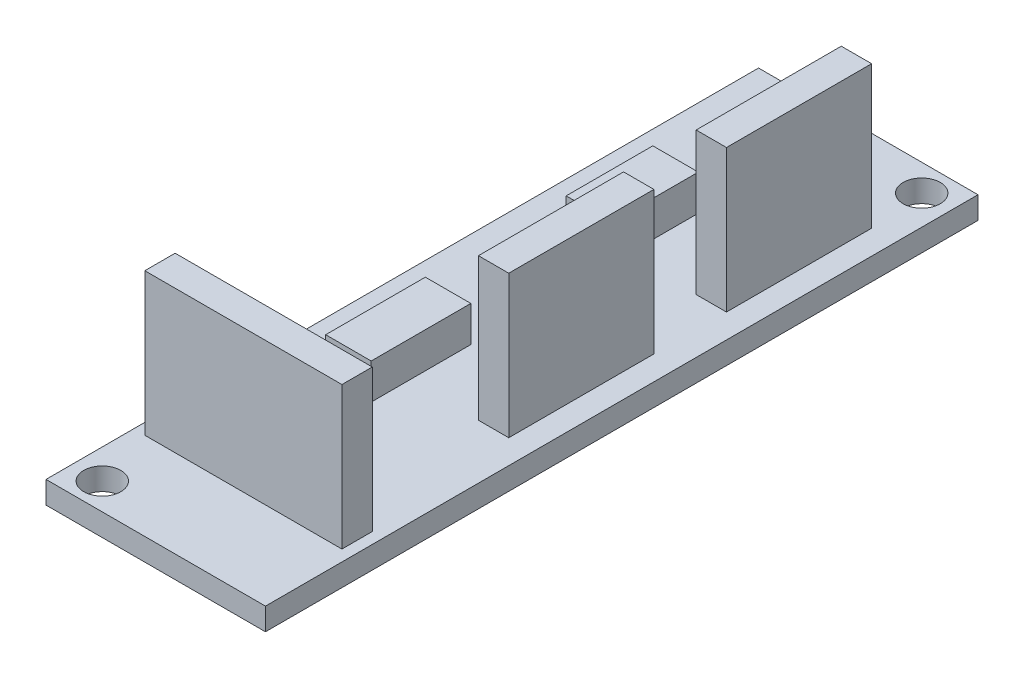
ISO-10303-21;
HEADER;
FILE_DESCRIPTION(('STEP AP214'),'2;1');
FILE_NAME('part.step','',(''),(''),'','','');
FILE_SCHEMA(('AUTOMOTIVE_DESIGN { 1 0 10303 214 1 1 1 1 }'));
ENDSEC;
DATA;
#1=APPLICATION_CONTEXT('core data for automotive mechanical design processes');
#2=APPLICATION_PROTOCOL_DEFINITION('international standard','automotive_design',2000,#1);
#3=PRODUCT_CONTEXT('',#1,'mechanical');
#4=PRODUCT('Part','Part','',(#3));
#5=PRODUCT_RELATED_PRODUCT_CATEGORY('part','',(#4));
#6=PRODUCT_DEFINITION_FORMATION('','',#4);
#7=PRODUCT_DEFINITION_CONTEXT('part definition',#1,'design');
#8=PRODUCT_DEFINITION('design','',#6,#7);
#9=PRODUCT_DEFINITION_SHAPE('','',#8);
#10=(LENGTH_UNIT() NAMED_UNIT(*) SI_UNIT(.MILLI.,.METRE.));
#11=(NAMED_UNIT(*) PLANE_ANGLE_UNIT() SI_UNIT($,.RADIAN.));
#12=(NAMED_UNIT(*) SI_UNIT($,.STERADIAN.) SOLID_ANGLE_UNIT());
#13=UNCERTAINTY_MEASURE_WITH_UNIT(LENGTH_MEASURE(1.E-05),#10,'distance_accuracy_value','');
#14=(GEOMETRIC_REPRESENTATION_CONTEXT(3) GLOBAL_UNCERTAINTY_ASSIGNED_CONTEXT((#13)) GLOBAL_UNIT_ASSIGNED_CONTEXT((#10,
#11,#12)) REPRESENTATION_CONTEXT('',''));
#15=CARTESIAN_POINT('',(0.,0.,0.));
#16=DIRECTION('',(0.,0.,1.));
#17=DIRECTION('',(1.,0.,0.));
#18=AXIS2_PLACEMENT_3D('',#15,#16,#17);
#19=CARTESIAN_POINT('',(0.,1.984375,0.));
#20=DIRECTION('',(0.,1.,0.));
#21=DIRECTION('',(0.,0.,1.));
#22=AXIS2_PLACEMENT_3D('',#19,#20,#21);
#23=PLANE('',#22);
#24=DIRECTION('',(1.,0.,0.));
#25=VECTOR('',#24,1.);
#26=CARTESIAN_POINT('',(-5.30932015618599,1.984375,-17.8586223435347));
#27=LINE('',#26,#25);
#28=CARTESIAN_POINT('',(-5.30932015618599,1.984375,-17.8586223435347));
#29=VERTEX_POINT('',#28);
#30=CARTESIAN_POINT('',(-1.25493021873488,1.984375,-17.8586223435347));
#31=VERTEX_POINT('',#30);
#32=EDGE_CURVE('E189',#29,#31,#27,.T.);
#33=ORIENTED_EDGE('',*,*,#32,.T.);
#34=DIRECTION('',(0.,0.,1.));
#35=VECTOR('',#34,1.);
#36=CARTESIAN_POINT('',(-1.25493021873488,1.984375,-17.8586223435347));
#37=LINE('',#36,#35);
#38=CARTESIAN_POINT('',(-1.25493021873488,1.984375,-10.1359748436278));
#39=VERTEX_POINT('',#38);
#40=EDGE_CURVE('E193',#31,#39,#37,.T.);
#41=ORIENTED_EDGE('',*,*,#40,.T.);
#42=DIRECTION('',(1.,0.,0.));
#43=VECTOR('',#42,1.);
#44=CARTESIAN_POINT('',(-5.30932015618599,1.984375,-10.1359748436278));
#45=LINE('',#44,#43);
#46=CARTESIAN_POINT('',(-5.30932015618599,1.984375,-10.1359748436278));
#47=VERTEX_POINT('',#46);
#48=EDGE_CURVE('E52',#47,#39,#45,.T.);
#49=ORIENTED_EDGE('',*,*,#48,.F.);
#50=DIRECTION('',(0.,0.,1.));
#51=VECTOR('',#50,1.);
#52=CARTESIAN_POINT('',(-5.30932015618599,1.984375,-17.8586223435347));
#53=LINE('',#52,#51);
#54=EDGE_CURVE('E47',#29,#47,#53,.T.);
#55=ORIENTED_EDGE('',*,*,#54,.F.);
#56=EDGE_LOOP('',(#33,#41,#49,#55));
#57=FACE_BOUND('',#56,.T.);
#58=DIRECTION('',(1.,0.,0.));
#59=VECTOR('',#58,1.);
#60=CARTESIAN_POINT('',(-5.30932015618599,1.984375,2.41332734372091));
#61=LINE('',#60,#59);
#62=CARTESIAN_POINT('',(-5.30932015618599,1.984375,2.41332734372091));
#63=VERTEX_POINT('',#62);
#64=CARTESIAN_POINT('',(-1.25493021873488,1.984375,2.41332734372091));
#65=VERTEX_POINT('',#64);
#66=EDGE_CURVE('E196',#63,#65,#61,.T.);
#67=ORIENTED_EDGE('',*,*,#66,.T.);
#68=DIRECTION('',(0.,0.,1.));
#69=VECTOR('',#68,1.);
#70=CARTESIAN_POINT('',(-1.25493021873488,1.984375,2.41332734372091));
#71=LINE('',#70,#69);
#72=CARTESIAN_POINT('',(-1.25493021873488,1.984375,11.2943719686138));
#73=VERTEX_POINT('',#72);
#74=EDGE_CURVE('E234',#65,#73,#71,.T.);
#75=ORIENTED_EDGE('',*,*,#74,.T.);
#76=DIRECTION('',(1.,0.,0.));
#77=VECTOR('',#76,1.);
#78=CARTESIAN_POINT('',(-5.30932015618599,1.984375,11.2943719686138));
#79=LINE('',#78,#77);
#80=CARTESIAN_POINT('',(-5.30932015618599,1.984375,11.2943719686138));
#81=VERTEX_POINT('',#80);
#82=EDGE_CURVE('E236',#81,#73,#79,.T.);
#83=ORIENTED_EDGE('',*,*,#82,.F.);
#84=DIRECTION('',(0.,0.,1.));
#85=VECTOR('',#84,1.);
#86=CARTESIAN_POINT('',(-5.30932015618599,1.984375,2.41332734372091));
#87=LINE('',#86,#85);
#88=EDGE_CURVE('E225',#63,#81,#87,.T.);
#89=ORIENTED_EDGE('',*,*,#88,.F.);
#90=EDGE_LOOP('',(#67,#75,#83,#89));
#91=FACE_BOUND('',#90,.T.);
#92=DIRECTION('',(0.,0.,-1.));
#93=VECTOR('',#92,1.);
#94=CARTESIAN_POINT('',(-8.78451153114408,1.984375,23.9402072497114));
#95=LINE('',#94,#93);
#96=CARTESIAN_POINT('',(-8.78451153114408,1.984375,23.9402072497114));
#97=VERTEX_POINT('',#96);
#98=CARTESIAN_POINT('',(-8.78451153114408,1.984375,21.2372806247439));
#99=VERTEX_POINT('',#98);
#100=EDGE_CURVE('E274',#97,#99,#95,.T.);
#101=ORIENTED_EDGE('',*,*,#100,.T.);
#102=DIRECTION('',(1.,0.,0.));
#103=VECTOR('',#102,1.);
#104=CARTESIAN_POINT('',(-8.78451153114408,1.984375,21.2372806247439));
#105=LINE('',#104,#103);
#106=CARTESIAN_POINT('',(8.78451153114408,1.984375,21.2372806247439));
#107=VERTEX_POINT('',#106);
#108=EDGE_CURVE('E272',#99,#107,#105,.T.);
#109=ORIENTED_EDGE('',*,*,#108,.T.);
#110=DIRECTION('',(0.,0.,-1.));
#111=VECTOR('',#110,1.);
#112=CARTESIAN_POINT('',(8.78451153114408,1.984375,23.9402072497114));
#113=LINE('',#112,#111);
#114=CARTESIAN_POINT('',(8.78451153114408,1.984375,23.9402072497114));
#115=VERTEX_POINT('',#114);
#116=EDGE_CURVE('E268',#115,#107,#113,.T.);
#117=ORIENTED_EDGE('',*,*,#116,.F.);
#118=DIRECTION('',(1.,0.,0.));
#119=VECTOR('',#118,1.);
#120=CARTESIAN_POINT('',(-8.78451153114408,1.984375,23.9402072497114));
#121=LINE('',#120,#119);
#122=EDGE_CURVE('E265',#97,#115,#121,.T.);
#123=ORIENTED_EDGE('',*,*,#122,.F.);
#124=EDGE_LOOP('',(#101,#109,#117,#123));
#125=FACE_BOUND('',#124,.T.);
#126=DIRECTION('',(1.,0.,0.));
#127=VECTOR('',#126,1.);
#128=CARTESIAN_POINT('',(4.92318778119064,1.984375,-5.01972087493947));
#129=LINE('',#128,#127);
#130=CARTESIAN_POINT('',(4.92318778119064,1.984375,-5.01972087493947));
#131=VERTEX_POINT('',#130);
#132=CARTESIAN_POINT('',(7.62611440615806,1.984375,-5.01972087493947));
#133=VERTEX_POINT('',#132);
#134=EDGE_CURVE('E306',#131,#133,#129,.T.);
#135=ORIENTED_EDGE('',*,*,#134,.T.);
#136=DIRECTION('',(0.,0.,1.));
#137=VECTOR('',#136,1.);
#138=CARTESIAN_POINT('',(7.62611440615806,1.984375,-5.01972087493947));
#139=LINE('',#138,#137);
#140=CARTESIAN_POINT('',(7.62611440615806,1.984375,7.91571368740457));
#141=VERTEX_POINT('',#140);
#142=EDGE_CURVE('E304',#133,#141,#139,.T.);
#143=ORIENTED_EDGE('',*,*,#142,.T.);
#144=DIRECTION('',(1.,0.,0.));
#145=VECTOR('',#144,1.);
#146=CARTESIAN_POINT('',(4.92318778119064,1.984375,7.91571368740457));
#147=LINE('',#146,#145);
#148=CARTESIAN_POINT('',(4.92318778119064,1.984375,7.91571368740457));
#149=VERTEX_POINT('',#148);
#150=EDGE_CURVE('E300',#149,#141,#147,.T.);
#151=ORIENTED_EDGE('',*,*,#150,.F.);
#152=DIRECTION('',(0.,0.,1.));
#153=VECTOR('',#152,1.);
#154=CARTESIAN_POINT('',(4.92318778119064,1.984375,-5.01972087493947));
#155=LINE('',#154,#153);
#156=EDGE_CURVE('E297',#131,#149,#155,.T.);
#157=ORIENTED_EDGE('',*,*,#156,.F.);
#158=EDGE_LOOP('',(#135,#143,#151,#157));
#159=FACE_BOUND('',#158,.T.);
#160=DIRECTION('',(1.,0.,0.));
#161=VECTOR('',#160,1.);
#162=CARTESIAN_POINT('',(4.92318778119063,1.984375,-24.4228727184555));
#163=LINE('',#162,#161);
#164=CARTESIAN_POINT('',(4.92318778119063,1.984375,-24.4228727184555));
#165=VERTEX_POINT('',#164);
#166=CARTESIAN_POINT('',(7.62611440615806,1.984375,-24.4228727184555));
#167=VERTEX_POINT('',#166);
#168=EDGE_CURVE('E308',#165,#167,#163,.T.);
#169=ORIENTED_EDGE('',*,*,#168,.T.);
#170=DIRECTION('',(0.,0.,1.));
#171=VECTOR('',#170,1.);
#172=CARTESIAN_POINT('',(7.62611440615806,1.984375,-24.4228727184555));
#173=LINE('',#172,#171);
#174=CARTESIAN_POINT('',(7.62611440615806,1.984375,-11.4874381561115));
#175=VERTEX_POINT('',#174);
#176=EDGE_CURVE('E330',#167,#175,#173,.T.);
#177=ORIENTED_EDGE('',*,*,#176,.T.);
#178=DIRECTION('',(1.,0.,0.));
#179=VECTOR('',#178,1.);
#180=CARTESIAN_POINT('',(4.92318778119064,1.984375,-11.4874381561115));
#181=LINE('',#180,#179);
#182=CARTESIAN_POINT('',(4.92318778119064,1.984375,-11.4874381561115));
#183=VERTEX_POINT('',#182);
#184=EDGE_CURVE('E332',#183,#175,#181,.T.);
#185=ORIENTED_EDGE('',*,*,#184,.F.);
#186=DIRECTION('',(0.,0.,1.));
#187=VECTOR('',#186,1.);
#188=CARTESIAN_POINT('',(4.92318778119063,1.984375,-24.4228727184555));
#189=LINE('',#188,#187);
#190=EDGE_CURVE('E321',#165,#183,#189,.T.);
#191=ORIENTED_EDGE('',*,*,#190,.F.);
#192=EDGE_LOOP('',(#169,#177,#185,#191));
#193=FACE_BOUND('',#192,.T.);
#194=CARTESIAN_POINT('',(7.14375,1.984375,-29.36875));
#195=DIRECTION('',(0.,1.,0.));
#196=DIRECTION('',(0.,0.,1.));
#197=AXIS2_PLACEMENT_3D('',#194,#195,#196);
#198=CIRCLE('',#197,1.651);
#199=CARTESIAN_POINT('',(7.14375,1.984375,-27.71775));
#200=VERTEX_POINT('',#199);
#201=EDGE_CURVE('E355',#200,#200,#198,.T.);
#202=ORIENTED_EDGE('',*,*,#201,.F.);
#203=EDGE_LOOP('',(#202));
#204=FACE_BOUND('',#203,.T.);
#205=DIRECTION('',(0.,0.,-1.));
#206=VECTOR('',#205,1.);
#207=CARTESIAN_POINT('',(9.77899999999999,1.984375,-31.75));
#208=LINE('',#207,#206);
#209=CARTESIAN_POINT('',(9.779,1.984375,31.75));
#210=VERTEX_POINT('',#209);
#211=CARTESIAN_POINT('',(9.77899999999999,1.984375,-31.75));
#212=VERTEX_POINT('',#211);
#213=EDGE_CURVE('E361',#210,#212,#208,.T.);
#214=ORIENTED_EDGE('',*,*,#213,.T.);
#215=DIRECTION('',(-1.,0.,0.));
#216=VECTOR('',#215,1.);
#217=CARTESIAN_POINT('',(-9.77900000000001,1.984375,-31.75));
#218=LINE('',#217,#216);
#219=CARTESIAN_POINT('',(-9.77900000000001,1.984375,-31.75));
#220=VERTEX_POINT('',#219);
#221=EDGE_CURVE('E364',#212,#220,#218,.T.);
#222=ORIENTED_EDGE('',*,*,#221,.T.);
#223=DIRECTION('',(0.,0.,1.));
#224=VECTOR('',#223,1.);
#225=CARTESIAN_POINT('',(-9.77900000000001,1.984375,-31.75));
#226=LINE('',#225,#224);
#227=CARTESIAN_POINT('',(-9.779,1.984375,31.75));
#228=VERTEX_POINT('',#227);
#229=EDGE_CURVE('E367',#220,#228,#226,.T.);
#230=ORIENTED_EDGE('',*,*,#229,.T.);
#231=DIRECTION('',(1.,0.,0.));
#232=VECTOR('',#231,1.);
#233=CARTESIAN_POINT('',(-9.779,1.984375,31.75));
#234=LINE('',#233,#232);
#235=EDGE_CURVE('E369',#228,#210,#234,.T.);
#236=ORIENTED_EDGE('',*,*,#235,.T.);
#237=EDGE_LOOP('',(#214,#222,#230,#236));
#238=FACE_BOUND('',#237,.T.);
#239=CARTESIAN_POINT('',(-7.14375,1.984375,29.36875));
#240=DIRECTION('',(0.,1.,0.));
#241=DIRECTION('',(0.,0.,1.));
#242=AXIS2_PLACEMENT_3D('',#239,#240,#241);
#243=CIRCLE('',#242,1.651);
#244=CARTESIAN_POINT('',(-7.14375,1.984375,31.01975));
#245=VERTEX_POINT('',#244);
#246=EDGE_CURVE('E349',#245,#245,#243,.T.);
#247=ORIENTED_EDGE('',*,*,#246,.F.);
#248=EDGE_LOOP('',(#247));
#249=FACE_BOUND('',#248,.T.);
#250=ADVANCED_FACE('F32',(#57,#91,#125,#159,#193,#204,#238,#249),#23,.T.);
#251=CARTESIAN_POINT('',(0.,0.,0.));
#252=DIRECTION('',(0.,1.,0.));
#253=DIRECTION('',(0.,0.,1.));
#254=AXIS2_PLACEMENT_3D('',#251,#252,#253);
#255=PLANE('',#254);
#256=CARTESIAN_POINT('',(7.14375,0.,-29.36875));
#257=DIRECTION('',(0.,1.,0.));
#258=DIRECTION('',(0.,0.,1.));
#259=AXIS2_PLACEMENT_3D('',#256,#257,#258);
#260=CIRCLE('',#259,1.651);
#261=CARTESIAN_POINT('',(7.14375,0.,-27.71775));
#262=VERTEX_POINT('',#261);
#263=EDGE_CURVE('E352',#262,#262,#260,.T.);
#264=ORIENTED_EDGE('',*,*,#263,.T.);
#265=EDGE_LOOP('',(#264));
#266=FACE_BOUND('',#265,.T.);
#267=DIRECTION('',(0.,0.,-1.));
#268=VECTOR('',#267,1.);
#269=CARTESIAN_POINT('',(9.77899999999999,0.,-31.75));
#270=LINE('',#269,#268);
#271=CARTESIAN_POINT('',(9.779,0.,31.75));
#272=VERTEX_POINT('',#271);
#273=CARTESIAN_POINT('',(9.77899999999999,0.,-31.75));
#274=VERTEX_POINT('',#273);
#275=EDGE_CURVE('E358',#272,#274,#270,.T.);
#276=ORIENTED_EDGE('',*,*,#275,.F.);
#277=DIRECTION('',(1.,0.,0.));
#278=VECTOR('',#277,1.);
#279=CARTESIAN_POINT('',(-9.779,0.,31.75));
#280=LINE('',#279,#278);
#281=CARTESIAN_POINT('',(-9.779,0.,31.75));
#282=VERTEX_POINT('',#281);
#283=EDGE_CURVE('E365',#282,#272,#280,.T.);
#284=ORIENTED_EDGE('',*,*,#283,.F.);
#285=DIRECTION('',(0.,0.,1.));
#286=VECTOR('',#285,1.);
#287=CARTESIAN_POINT('',(-9.77900000000001,0.,-31.75));
#288=LINE('',#287,#286);
#289=CARTESIAN_POINT('',(-9.77900000000001,0.,-31.75));
#290=VERTEX_POINT('',#289);
#291=EDGE_CURVE('E376',#290,#282,#288,.T.);
#292=ORIENTED_EDGE('',*,*,#291,.F.);
#293=DIRECTION('',(-1.,0.,0.));
#294=VECTOR('',#293,1.);
#295=CARTESIAN_POINT('',(-9.77900000000001,0.,-31.75));
#296=LINE('',#295,#294);
#297=EDGE_CURVE('E374',#274,#290,#296,.T.);
#298=ORIENTED_EDGE('',*,*,#297,.F.);
#299=EDGE_LOOP('',(#276,#284,#292,#298));
#300=FACE_BOUND('',#299,.T.);
#301=CARTESIAN_POINT('',(-7.14375,0.,29.36875));
#302=DIRECTION('',(0.,1.,0.));
#303=DIRECTION('',(0.,0.,1.));
#304=AXIS2_PLACEMENT_3D('',#301,#302,#303);
#305=CIRCLE('',#304,1.651);
#306=CARTESIAN_POINT('',(-7.14375,0.,31.01975));
#307=VERTEX_POINT('',#306);
#308=EDGE_CURVE('E340',#307,#307,#305,.T.);
#309=ORIENTED_EDGE('',*,*,#308,.T.);
#310=EDGE_LOOP('',(#309));
#311=FACE_BOUND('',#310,.T.);
#312=ADVANCED_FACE('F394',(#266,#300,#311),#255,.F.);
#313=CARTESIAN_POINT('',(9.77899999999999,1.984375,-31.75));
#314=DIRECTION('',(-1.,0.,0.));
#315=DIRECTION('',(0.,0.,1.));
#316=AXIS2_PLACEMENT_3D('',#313,#314,#315);
#317=PLANE('',#316);
#318=ORIENTED_EDGE('',*,*,#275,.T.);
#319=DIRECTION('',(0.,-1.,0.));
#320=VECTOR('',#319,1.);
#321=CARTESIAN_POINT('',(9.77899999999999,1.984375,-31.75));
#322=LINE('',#321,#320);
#323=EDGE_CURVE('E11',#212,#274,#322,.T.);
#324=ORIENTED_EDGE('',*,*,#323,.F.);
#325=ORIENTED_EDGE('',*,*,#213,.F.);
#326=DIRECTION('',(0.,-1.,0.));
#327=VECTOR('',#326,1.);
#328=CARTESIAN_POINT('',(9.779,1.984375,31.75));
#329=LINE('',#328,#327);
#330=EDGE_CURVE('E371',#210,#272,#329,.T.);
#331=ORIENTED_EDGE('',*,*,#330,.T.);
#332=EDGE_LOOP('',(#318,#324,#325,#331));
#333=FACE_BOUND('',#332,.T.);
#334=ADVANCED_FACE('F34',(#333),#317,.F.);
#335=CARTESIAN_POINT('',(-9.77900000000001,1.984375,-31.75));
#336=DIRECTION('',(0.,0.,1.));
#337=DIRECTION('',(1.,0.,0.));
#338=AXIS2_PLACEMENT_3D('',#335,#336,#337);
#339=PLANE('',#338);
#340=ORIENTED_EDGE('',*,*,#297,.T.);
#341=DIRECTION('',(0.,-1.,0.));
#342=VECTOR('',#341,1.);
#343=CARTESIAN_POINT('',(-9.77900000000001,1.984375,-31.75));
#344=LINE('',#343,#342);
#345=EDGE_CURVE('E40',#220,#290,#344,.T.);
#346=ORIENTED_EDGE('',*,*,#345,.F.);
#347=ORIENTED_EDGE('',*,*,#221,.F.);
#348=ORIENTED_EDGE('',*,*,#323,.T.);
#349=EDGE_LOOP('',(#340,#346,#347,#348));
#350=FACE_BOUND('',#349,.T.);
#351=ADVANCED_FACE('F405',(#350),#339,.F.);
#352=CARTESIAN_POINT('',(-9.77900000000001,1.984375,-31.75));
#353=DIRECTION('',(1.,0.,0.));
#354=DIRECTION('',(0.,0.,-1.));
#355=AXIS2_PLACEMENT_3D('',#352,#353,#354);
#356=PLANE('',#355);
#357=ORIENTED_EDGE('',*,*,#291,.T.);
#358=DIRECTION('',(0.,-1.,0.));
#359=VECTOR('',#358,1.);
#360=CARTESIAN_POINT('',(-9.779,1.984375,31.75));
#361=LINE('',#360,#359);
#362=EDGE_CURVE('E381',#228,#282,#361,.T.);
#363=ORIENTED_EDGE('',*,*,#362,.F.);
#364=ORIENTED_EDGE('',*,*,#229,.F.);
#365=ORIENTED_EDGE('',*,*,#345,.T.);
#366=EDGE_LOOP('',(#357,#363,#364,#365));
#367=FACE_BOUND('',#366,.T.);
#368=ADVANCED_FACE('F388',(#367),#356,.F.);
#369=CARTESIAN_POINT('',(-9.779,1.984375,31.75));
#370=DIRECTION('',(0.,0.,-1.));
#371=DIRECTION('',(-1.,0.,0.));
#372=AXIS2_PLACEMENT_3D('',#369,#370,#371);
#373=PLANE('',#372);
#374=ORIENTED_EDGE('',*,*,#283,.T.);
#375=ORIENTED_EDGE('',*,*,#330,.F.);
#376=ORIENTED_EDGE('',*,*,#235,.F.);
#377=ORIENTED_EDGE('',*,*,#362,.T.);
#378=EDGE_LOOP('',(#374,#375,#376,#377));
#379=FACE_BOUND('',#378,.T.);
#380=ADVANCED_FACE('F398',(#379),#373,.F.);
#381=CARTESIAN_POINT('',(7.14375,1.984375,-29.36875));
#382=DIRECTION('',(0.,-1.,0.));
#383=DIRECTION('',(0.,0.,-1.));
#384=AXIS2_PLACEMENT_3D('',#381,#382,#383);
#385=CYLINDRICAL_SURFACE('',#384,1.651);
#386=ORIENTED_EDGE('',*,*,#201,.T.);
#387=EDGE_LOOP('',(#386));
#388=FACE_BOUND('',#387,.T.);
#389=ORIENTED_EDGE('',*,*,#263,.F.);
#390=EDGE_LOOP('',(#389));
#391=FACE_BOUND('',#390,.T.);
#392=ADVANCED_FACE('F420',(#388,#391),#385,.F.);
#393=CARTESIAN_POINT('',(-7.14375,1.984375,29.36875));
#394=DIRECTION('',(0.,-1.,0.));
#395=DIRECTION('',(0.,0.,-1.));
#396=AXIS2_PLACEMENT_3D('',#393,#394,#395);
#397=CYLINDRICAL_SURFACE('',#396,1.651);
#398=ORIENTED_EDGE('',*,*,#246,.T.);
#399=EDGE_LOOP('',(#398));
#400=FACE_BOUND('',#399,.T.);
#401=ORIENTED_EDGE('',*,*,#308,.F.);
#402=EDGE_LOOP('',(#401));
#403=FACE_BOUND('',#402,.T.);
#404=ADVANCED_FACE('F427',(#400,#403),#397,.F.);
#405=CARTESIAN_POINT('',(4.92318778119063,14.684375,-24.4228727184555));
#406=DIRECTION('',(0.,0.,-1.));
#407=DIRECTION('',(-1.,0.,0.));
#408=AXIS2_PLACEMENT_3D('',#405,#406,#407);
#409=PLANE('',#408);
#410=ORIENTED_EDGE('',*,*,#168,.F.);
#411=DIRECTION('',(0.,-1.,0.));
#412=VECTOR('',#411,1.);
#413=CARTESIAN_POINT('',(4.92318778119063,14.684375,-24.4228727184555));
#414=LINE('',#413,#412);
#415=CARTESIAN_POINT('',(4.92318778119063,14.684375,-24.4228727184555));
#416=VERTEX_POINT('',#415);
#417=EDGE_CURVE('E337',#416,#165,#414,.T.);
#418=ORIENTED_EDGE('',*,*,#417,.F.);
#419=DIRECTION('',(1.,0.,0.));
#420=VECTOR('',#419,1.);
#421=CARTESIAN_POINT('',(4.92318778119063,14.684375,-24.4228727184555));
#422=LINE('',#421,#420);
#423=CARTESIAN_POINT('',(7.62611440615806,14.684375,-24.4228727184555));
#424=VERTEX_POINT('',#423);
#425=EDGE_CURVE('E317',#416,#424,#422,.T.);
#426=ORIENTED_EDGE('',*,*,#425,.T.);
#427=DIRECTION('',(0.,-1.,0.));
#428=VECTOR('',#427,1.);
#429=CARTESIAN_POINT('',(7.62611440615806,14.684375,-24.4228727184555));
#430=LINE('',#429,#428);
#431=EDGE_CURVE('E328',#424,#167,#430,.T.);
#432=ORIENTED_EDGE('',*,*,#431,.T.);
#433=EDGE_LOOP('',(#410,#418,#426,#432));
#434=FACE_BOUND('',#433,.T.);
#435=ADVANCED_FACE('F432',(#434),#409,.T.);
#436=CARTESIAN_POINT('',(4.92318778119063,14.684375,-24.4228727184555));
#437=DIRECTION('',(1.,0.,0.));
#438=DIRECTION('',(0.,0.,-1.));
#439=AXIS2_PLACEMENT_3D('',#436,#437,#438);
#440=PLANE('',#439);
#441=ORIENTED_EDGE('',*,*,#190,.T.);
#442=DIRECTION('',(0.,-1.,0.));
#443=VECTOR('',#442,1.);
#444=CARTESIAN_POINT('',(4.92318778119064,14.684375,-11.4874381561115));
#445=LINE('',#444,#443);
#446=CARTESIAN_POINT('',(4.92318778119064,14.684375,-11.4874381561115));
#447=VERTEX_POINT('',#446);
#448=EDGE_CURVE('E341',#447,#183,#445,.T.);
#449=ORIENTED_EDGE('',*,*,#448,.F.);
#450=DIRECTION('',(0.,0.,1.));
#451=VECTOR('',#450,1.);
#452=CARTESIAN_POINT('',(4.92318778119063,14.684375,-24.4228727184555));
#453=LINE('',#452,#451);
#454=EDGE_CURVE('E326',#416,#447,#453,.T.);
#455=ORIENTED_EDGE('',*,*,#454,.F.);
#456=ORIENTED_EDGE('',*,*,#417,.T.);
#457=EDGE_LOOP('',(#441,#449,#455,#456));
#458=FACE_BOUND('',#457,.T.);
#459=ADVANCED_FACE('F441',(#458),#440,.F.);
#460=CARTESIAN_POINT('',(4.92318778119064,14.684375,-11.4874381561115));
#461=DIRECTION('',(0.,0.,-1.));
#462=DIRECTION('',(-1.,0.,0.));
#463=AXIS2_PLACEMENT_3D('',#460,#461,#462);
#464=PLANE('',#463);
#465=ORIENTED_EDGE('',*,*,#184,.T.);
#466=DIRECTION('',(0.,-1.,0.));
#467=VECTOR('',#466,1.);
#468=CARTESIAN_POINT('',(7.62611440615806,14.684375,-11.4874381561115));
#469=LINE('',#468,#467);
#470=CARTESIAN_POINT('',(7.62611440615806,14.684375,-11.4874381561115));
#471=VERTEX_POINT('',#470);
#472=EDGE_CURVE('E344',#471,#175,#469,.T.);
#473=ORIENTED_EDGE('',*,*,#472,.F.);
#474=DIRECTION('',(1.,0.,0.));
#475=VECTOR('',#474,1.);
#476=CARTESIAN_POINT('',(4.92318778119064,14.684375,-11.4874381561115));
#477=LINE('',#476,#475);
#478=EDGE_CURVE('E324',#447,#471,#477,.T.);
#479=ORIENTED_EDGE('',*,*,#478,.F.);
#480=ORIENTED_EDGE('',*,*,#448,.T.);
#481=EDGE_LOOP('',(#465,#473,#479,#480));
#482=FACE_BOUND('',#481,.T.);
#483=ADVANCED_FACE('F450',(#482),#464,.F.);
#484=CARTESIAN_POINT('',(7.62611440615806,14.684375,-24.4228727184555));
#485=DIRECTION('',(1.,0.,0.));
#486=DIRECTION('',(0.,0.,-1.));
#487=AXIS2_PLACEMENT_3D('',#484,#485,#486);
#488=PLANE('',#487);
#489=ORIENTED_EDGE('',*,*,#176,.F.);
#490=ORIENTED_EDGE('',*,*,#431,.F.);
#491=DIRECTION('',(0.,0.,1.));
#492=VECTOR('',#491,1.);
#493=CARTESIAN_POINT('',(7.62611440615806,14.684375,-24.4228727184555));
#494=LINE('',#493,#492);
#495=EDGE_CURVE('E320',#424,#471,#494,.T.);
#496=ORIENTED_EDGE('',*,*,#495,.T.);
#497=ORIENTED_EDGE('',*,*,#472,.T.);
#498=EDGE_LOOP('',(#489,#490,#496,#497));
#499=FACE_BOUND('',#498,.T.);
#500=ADVANCED_FACE('F446',(#499),#488,.T.);
#501=CARTESIAN_POINT('',(0.,14.684375,0.));
#502=DIRECTION('',(0.,-1.,0.));
#503=DIRECTION('',(0.,0.,-1.));
#504=AXIS2_PLACEMENT_3D('',#501,#502,#503);
#505=PLANE('',#504);
#506=ORIENTED_EDGE('',*,*,#425,.F.);
#507=ORIENTED_EDGE('',*,*,#454,.T.);
#508=ORIENTED_EDGE('',*,*,#478,.T.);
#509=ORIENTED_EDGE('',*,*,#495,.F.);
#510=EDGE_LOOP('',(#506,#507,#508,#509));
#511=FACE_BOUND('',#510,.T.);
#512=ADVANCED_FACE('F449',(#511),#505,.F.);
#513=CARTESIAN_POINT('',(4.92318778119064,14.684375,-5.01972087493947));
#514=DIRECTION('',(0.,0.,-1.));
#515=DIRECTION('',(-1.,0.,0.));
#516=AXIS2_PLACEMENT_3D('',#513,#514,#515);
#517=PLANE('',#516);
#518=ORIENTED_EDGE('',*,*,#134,.F.);
#519=DIRECTION('',(0.,-1.,0.));
#520=VECTOR('',#519,1.);
#521=CARTESIAN_POINT('',(4.92318778119064,14.684375,-5.01972087493947));
#522=LINE('',#521,#520);
#523=CARTESIAN_POINT('',(4.92318778119064,14.684375,-5.01972087493947));
#524=VERTEX_POINT('',#523);
#525=EDGE_CURVE('E276',#524,#131,#522,.T.);
#526=ORIENTED_EDGE('',*,*,#525,.F.);
#527=DIRECTION('',(1.,0.,0.));
#528=VECTOR('',#527,1.);
#529=CARTESIAN_POINT('',(4.92318778119064,14.684375,-5.01972087493947));
#530=LINE('',#529,#528);
#531=CARTESIAN_POINT('',(7.62611440615806,14.684375,-5.01972087493947));
#532=VERTEX_POINT('',#531);
#533=EDGE_CURVE('E301',#524,#532,#530,.T.);
#534=ORIENTED_EDGE('',*,*,#533,.T.);
#535=DIRECTION('',(0.,-1.,0.));
#536=VECTOR('',#535,1.);
#537=CARTESIAN_POINT('',(7.62611440615806,14.684375,-5.01972087493947));
#538=LINE('',#537,#536);
#539=EDGE_CURVE('E285',#532,#133,#538,.T.);
#540=ORIENTED_EDGE('',*,*,#539,.T.);
#541=EDGE_LOOP('',(#518,#526,#534,#540));
#542=FACE_BOUND('',#541,.T.);
#543=ADVANCED_FACE('F460',(#542),#517,.T.);
#544=CARTESIAN_POINT('',(4.92318778119064,14.684375,-5.01972087493947));
#545=DIRECTION('',(1.,0.,0.));
#546=DIRECTION('',(0.,0.,-1.));
#547=AXIS2_PLACEMENT_3D('',#544,#545,#546);
#548=PLANE('',#547);
#549=ORIENTED_EDGE('',*,*,#156,.T.);
#550=DIRECTION('',(0.,-1.,0.));
#551=VECTOR('',#550,1.);
#552=CARTESIAN_POINT('',(4.92318778119064,14.684375,7.91571368740457));
#553=LINE('',#552,#551);
#554=CARTESIAN_POINT('',(4.92318778119064,14.684375,7.91571368740457));
#555=VERTEX_POINT('',#554);
#556=EDGE_CURVE('E292',#555,#149,#553,.T.);
#557=ORIENTED_EDGE('',*,*,#556,.F.);
#558=DIRECTION('',(0.,0.,1.));
#559=VECTOR('',#558,1.);
#560=CARTESIAN_POINT('',(4.92318778119064,14.684375,-5.01972087493947));
#561=LINE('',#560,#559);
#562=EDGE_CURVE('E288',#524,#555,#561,.T.);
#563=ORIENTED_EDGE('',*,*,#562,.F.);
#564=ORIENTED_EDGE('',*,*,#525,.T.);
#565=EDGE_LOOP('',(#549,#557,#563,#564));
#566=FACE_BOUND('',#565,.T.);
#567=ADVANCED_FACE('F468',(#566),#548,.F.);
#568=CARTESIAN_POINT('',(4.92318778119064,14.684375,7.91571368740457));
#569=DIRECTION('',(0.,0.,-1.));
#570=DIRECTION('',(-1.,0.,0.));
#571=AXIS2_PLACEMENT_3D('',#568,#569,#570);
#572=PLANE('',#571);
#573=ORIENTED_EDGE('',*,*,#150,.T.);
#574=DIRECTION('',(0.,-1.,0.));
#575=VECTOR('',#574,1.);
#576=CARTESIAN_POINT('',(7.62611440615806,14.684375,7.91571368740457));
#577=LINE('',#576,#575);
#578=CARTESIAN_POINT('',(7.62611440615806,14.684375,7.91571368740457));
#579=VERTEX_POINT('',#578);
#580=EDGE_CURVE('E289',#579,#141,#577,.T.);
#581=ORIENTED_EDGE('',*,*,#580,.F.);
#582=DIRECTION('',(1.,0.,0.));
#583=VECTOR('',#582,1.);
#584=CARTESIAN_POINT('',(4.92318778119064,14.684375,7.91571368740457));
#585=LINE('',#584,#583);
#586=EDGE_CURVE('E310',#555,#579,#585,.T.);
#587=ORIENTED_EDGE('',*,*,#586,.F.);
#588=ORIENTED_EDGE('',*,*,#556,.T.);
#589=EDGE_LOOP('',(#573,#581,#587,#588));
#590=FACE_BOUND('',#589,.T.);
#591=ADVANCED_FACE('F471',(#590),#572,.F.);
#592=CARTESIAN_POINT('',(7.62611440615806,14.684375,-5.01972087493947));
#593=DIRECTION('',(1.,0.,0.));
#594=DIRECTION('',(0.,0.,-1.));
#595=AXIS2_PLACEMENT_3D('',#592,#593,#594);
#596=PLANE('',#595);
#597=ORIENTED_EDGE('',*,*,#142,.F.);
#598=ORIENTED_EDGE('',*,*,#539,.F.);
#599=DIRECTION('',(0.,0.,1.));
#600=VECTOR('',#599,1.);
#601=CARTESIAN_POINT('',(7.62611440615806,14.684375,-5.01972087493947));
#602=LINE('',#601,#600);
#603=EDGE_CURVE('E312',#532,#579,#602,.T.);
#604=ORIENTED_EDGE('',*,*,#603,.T.);
#605=ORIENTED_EDGE('',*,*,#580,.T.);
#606=EDGE_LOOP('',(#597,#598,#604,#605));
#607=FACE_BOUND('',#606,.T.);
#608=ADVANCED_FACE('F466',(#607),#596,.T.);
#609=CARTESIAN_POINT('',(0.,14.684375,0.));
#610=DIRECTION('',(0.,-1.,0.));
#611=DIRECTION('',(0.,0.,-1.));
#612=AXIS2_PLACEMENT_3D('',#609,#610,#611);
#613=PLANE('',#612);
#614=ORIENTED_EDGE('',*,*,#533,.F.);
#615=ORIENTED_EDGE('',*,*,#562,.T.);
#616=ORIENTED_EDGE('',*,*,#586,.T.);
#617=ORIENTED_EDGE('',*,*,#603,.F.);
#618=EDGE_LOOP('',(#614,#615,#616,#617));
#619=FACE_BOUND('',#618,.T.);
#620=ADVANCED_FACE('F462',(#619),#613,.F.);
#621=CARTESIAN_POINT('',(-8.78451153114408,14.684375,23.9402072497114));
#622=DIRECTION('',(-1.,0.,0.));
#623=DIRECTION('',(0.,0.,1.));
#624=AXIS2_PLACEMENT_3D('',#621,#622,#623);
#625=PLANE('',#624);
#626=ORIENTED_EDGE('',*,*,#100,.F.);
#627=DIRECTION('',(0.,-1.,0.));
#628=VECTOR('',#627,1.);
#629=CARTESIAN_POINT('',(-8.78451153114408,14.684375,23.9402072497114));
#630=LINE('',#629,#628);
#631=CARTESIAN_POINT('',(-8.78451153114408,14.684375,23.9402072497114));
#632=VERTEX_POINT('',#631);
#633=EDGE_CURVE('E244',#632,#97,#630,.T.);
#634=ORIENTED_EDGE('',*,*,#633,.F.);
#635=DIRECTION('',(0.,0.,-1.));
#636=VECTOR('',#635,1.);
#637=CARTESIAN_POINT('',(-8.78451153114408,14.684375,23.9402072497114));
#638=LINE('',#637,#636);
#639=CARTESIAN_POINT('',(-8.78451153114408,14.684375,21.2372806247439));
#640=VERTEX_POINT('',#639);
#641=EDGE_CURVE('E269',#632,#640,#638,.T.);
#642=ORIENTED_EDGE('',*,*,#641,.T.);
#643=DIRECTION('',(0.,-1.,0.));
#644=VECTOR('',#643,1.);
#645=CARTESIAN_POINT('',(-8.78451153114408,14.684375,21.2372806247439));
#646=LINE('',#645,#644);
#647=EDGE_CURVE('E253',#640,#99,#646,.T.);
#648=ORIENTED_EDGE('',*,*,#647,.T.);
#649=EDGE_LOOP('',(#626,#634,#642,#648));
#650=FACE_BOUND('',#649,.T.);
#651=ADVANCED_FACE('F465',(#650),#625,.T.);
#652=CARTESIAN_POINT('',(-8.78451153114408,14.684375,23.9402072497114));
#653=DIRECTION('',(0.,0.,-1.));
#654=DIRECTION('',(-1.,0.,0.));
#655=AXIS2_PLACEMENT_3D('',#652,#653,#654);
#656=PLANE('',#655);
#657=ORIENTED_EDGE('',*,*,#122,.T.);
#658=DIRECTION('',(0.,-1.,0.));
#659=VECTOR('',#658,1.);
#660=CARTESIAN_POINT('',(8.78451153114408,14.684375,23.9402072497114));
#661=LINE('',#660,#659);
#662=CARTESIAN_POINT('',(8.78451153114408,14.684375,23.9402072497114));
#663=VERTEX_POINT('',#662);
#664=EDGE_CURVE('E260',#663,#115,#661,.T.);
#665=ORIENTED_EDGE('',*,*,#664,.F.);
#666=DIRECTION('',(1.,0.,0.));
#667=VECTOR('',#666,1.);
#668=CARTESIAN_POINT('',(-8.78451153114408,14.684375,23.9402072497114));
#669=LINE('',#668,#667);
#670=EDGE_CURVE('E256',#632,#663,#669,.T.);
#671=ORIENTED_EDGE('',*,*,#670,.F.);
#672=ORIENTED_EDGE('',*,*,#633,.T.);
#673=EDGE_LOOP('',(#657,#665,#671,#672));
#674=FACE_BOUND('',#673,.T.);
#675=ADVANCED_FACE('F488',(#674),#656,.F.);
#676=CARTESIAN_POINT('',(8.78451153114408,14.684375,23.9402072497114));
#677=DIRECTION('',(-1.,0.,0.));
#678=DIRECTION('',(0.,0.,1.));
#679=AXIS2_PLACEMENT_3D('',#676,#677,#678);
#680=PLANE('',#679);
#681=ORIENTED_EDGE('',*,*,#116,.T.);
#682=DIRECTION('',(0.,-1.,0.));
#683=VECTOR('',#682,1.);
#684=CARTESIAN_POINT('',(8.78451153114408,14.684375,21.2372806247439));
#685=LINE('',#684,#683);
#686=CARTESIAN_POINT('',(8.78451153114408,14.684375,21.2372806247439));
#687=VERTEX_POINT('',#686);
#688=EDGE_CURVE('E257',#687,#107,#685,.T.);
#689=ORIENTED_EDGE('',*,*,#688,.F.);
#690=DIRECTION('',(0.,0.,-1.));
#691=VECTOR('',#690,1.);
#692=CARTESIAN_POINT('',(8.78451153114408,14.684375,23.9402072497114));
#693=LINE('',#692,#691);
#694=EDGE_CURVE('E278',#663,#687,#693,.T.);
#695=ORIENTED_EDGE('',*,*,#694,.F.);
#696=ORIENTED_EDGE('',*,*,#664,.T.);
#697=EDGE_LOOP('',(#681,#689,#695,#696));
#698=FACE_BOUND('',#697,.T.);
#699=ADVANCED_FACE('F491',(#698),#680,.F.);
#700=CARTESIAN_POINT('',(-8.78451153114408,14.684375,21.2372806247439));
#701=DIRECTION('',(0.,0.,-1.));
#702=DIRECTION('',(-1.,0.,0.));
#703=AXIS2_PLACEMENT_3D('',#700,#701,#702);
#704=PLANE('',#703);
#705=ORIENTED_EDGE('',*,*,#108,.F.);
#706=ORIENTED_EDGE('',*,*,#647,.F.);
#707=DIRECTION('',(1.,0.,0.));
#708=VECTOR('',#707,1.);
#709=CARTESIAN_POINT('',(-8.78451153114408,14.684375,21.2372806247439));
#710=LINE('',#709,#708);
#711=EDGE_CURVE('E280',#640,#687,#710,.T.);
#712=ORIENTED_EDGE('',*,*,#711,.T.);
#713=ORIENTED_EDGE('',*,*,#688,.T.);
#714=EDGE_LOOP('',(#705,#706,#712,#713));
#715=FACE_BOUND('',#714,.T.);
#716=ADVANCED_FACE('F486',(#715),#704,.T.);
#717=CARTESIAN_POINT('',(0.,14.684375,0.));
#718=DIRECTION('',(0.,-1.,0.));
#719=DIRECTION('',(0.,0.,-1.));
#720=AXIS2_PLACEMENT_3D('',#717,#718,#719);
#721=PLANE('',#720);
#722=ORIENTED_EDGE('',*,*,#641,.F.);
#723=ORIENTED_EDGE('',*,*,#670,.T.);
#724=ORIENTED_EDGE('',*,*,#694,.T.);
#725=ORIENTED_EDGE('',*,*,#711,.F.);
#726=EDGE_LOOP('',(#722,#723,#724,#725));
#727=FACE_BOUND('',#726,.T.);
#728=ADVANCED_FACE('F482',(#727),#721,.F.);
#729=CARTESIAN_POINT('',(-5.30932015618599,5.159375,2.41332734372091));
#730=DIRECTION('',(0.,0.,-1.));
#731=DIRECTION('',(-1.,0.,0.));
#732=AXIS2_PLACEMENT_3D('',#729,#730,#731);
#733=PLANE('',#732);
#734=ORIENTED_EDGE('',*,*,#66,.F.);
#735=DIRECTION('',(0.,-1.,0.));
#736=VECTOR('',#735,1.);
#737=CARTESIAN_POINT('',(-5.30932015618599,5.159375,2.41332734372091));
#738=LINE('',#737,#736);
#739=CARTESIAN_POINT('',(-5.30932015618599,5.159375,2.41332734372091));
#740=VERTEX_POINT('',#739);
#741=EDGE_CURVE('E241',#740,#63,#738,.T.);
#742=ORIENTED_EDGE('',*,*,#741,.F.);
#743=DIRECTION('',(1.,0.,0.));
#744=VECTOR('',#743,1.);
#745=CARTESIAN_POINT('',(-5.30932015618599,5.159375,2.41332734372091));
#746=LINE('',#745,#744);
#747=CARTESIAN_POINT('',(-1.25493021873488,5.159375,2.41332734372091));
#748=VERTEX_POINT('',#747);
#749=EDGE_CURVE('E221',#740,#748,#746,.T.);
#750=ORIENTED_EDGE('',*,*,#749,.T.);
#751=DIRECTION('',(0.,-1.,0.));
#752=VECTOR('',#751,1.);
#753=CARTESIAN_POINT('',(-1.25493021873488,5.159375,2.41332734372091));
#754=LINE('',#753,#752);
#755=EDGE_CURVE('E232',#748,#65,#754,.T.);
#756=ORIENTED_EDGE('',*,*,#755,.T.);
#757=EDGE_LOOP('',(#734,#742,#750,#756));
#758=FACE_BOUND('',#757,.T.);
#759=ADVANCED_FACE('F485',(#758),#733,.T.);
#760=CARTESIAN_POINT('',(-5.30932015618599,5.159375,2.41332734372091));
#761=DIRECTION('',(1.,0.,0.));
#762=DIRECTION('',(0.,0.,-1.));
#763=AXIS2_PLACEMENT_3D('',#760,#761,#762);
#764=PLANE('',#763);
#765=ORIENTED_EDGE('',*,*,#88,.T.);
#766=DIRECTION('',(0.,-1.,0.));
#767=VECTOR('',#766,1.);
#768=CARTESIAN_POINT('',(-5.30932015618599,5.159375,11.2943719686138));
#769=LINE('',#768,#767);
#770=CARTESIAN_POINT('',(-5.30932015618599,5.159375,11.2943719686138));
#771=VERTEX_POINT('',#770);
#772=EDGE_CURVE('E245',#771,#81,#769,.T.);
#773=ORIENTED_EDGE('',*,*,#772,.F.);
#774=DIRECTION('',(0.,0.,1.));
#775=VECTOR('',#774,1.);
#776=CARTESIAN_POINT('',(-5.30932015618599,5.159375,2.41332734372091));
#777=LINE('',#776,#775);
#778=EDGE_CURVE('E230',#740,#771,#777,.T.);
#779=ORIENTED_EDGE('',*,*,#778,.F.);
#780=ORIENTED_EDGE('',*,*,#741,.T.);
#781=EDGE_LOOP('',(#765,#773,#779,#780));
#782=FACE_BOUND('',#781,.T.);
#783=ADVANCED_FACE('F504',(#782),#764,.F.);
#784=CARTESIAN_POINT('',(-5.30932015618599,5.159375,11.2943719686138));
#785=DIRECTION('',(0.,0.,-1.));
#786=DIRECTION('',(-1.,0.,0.));
#787=AXIS2_PLACEMENT_3D('',#784,#785,#786);
#788=PLANE('',#787);
#789=ORIENTED_EDGE('',*,*,#82,.T.);
#790=DIRECTION('',(0.,-1.,0.));
#791=VECTOR('',#790,1.);
#792=CARTESIAN_POINT('',(-1.25493021873488,5.159375,11.2943719686138));
#793=LINE('',#792,#791);
#794=CARTESIAN_POINT('',(-1.25493021873488,5.159375,11.2943719686138));
#795=VERTEX_POINT('',#794);
#796=EDGE_CURVE('E248',#795,#73,#793,.T.);
#797=ORIENTED_EDGE('',*,*,#796,.F.);
#798=DIRECTION('',(1.,0.,0.));
#799=VECTOR('',#798,1.);
#800=CARTESIAN_POINT('',(-5.30932015618599,5.159375,11.2943719686138));
#801=LINE('',#800,#799);
#802=EDGE_CURVE('E228',#771,#795,#801,.T.);
#803=ORIENTED_EDGE('',*,*,#802,.F.);
#804=ORIENTED_EDGE('',*,*,#772,.T.);
#805=EDGE_LOOP('',(#789,#797,#803,#804));
#806=FACE_BOUND('',#805,.T.);
#807=ADVANCED_FACE('F510',(#806),#788,.F.);
#808=CARTESIAN_POINT('',(-1.25493021873488,5.159375,2.41332734372091));
#809=DIRECTION('',(1.,0.,0.));
#810=DIRECTION('',(0.,0.,-1.));
#811=AXIS2_PLACEMENT_3D('',#808,#809,#810);
#812=PLANE('',#811);
#813=ORIENTED_EDGE('',*,*,#74,.F.);
#814=ORIENTED_EDGE('',*,*,#755,.F.);
#815=DIRECTION('',(0.,0.,1.));
#816=VECTOR('',#815,1.);
#817=CARTESIAN_POINT('',(-1.25493021873488,5.159375,2.41332734372091));
#818=LINE('',#817,#816);
#819=EDGE_CURVE('E224',#748,#795,#818,.T.);
#820=ORIENTED_EDGE('',*,*,#819,.T.);
#821=ORIENTED_EDGE('',*,*,#796,.T.);
#822=EDGE_LOOP('',(#813,#814,#820,#821));
#823=FACE_BOUND('',#822,.T.);
#824=ADVANCED_FACE('F506',(#823),#812,.T.);
#825=CARTESIAN_POINT('',(0.,5.159375,0.));
#826=DIRECTION('',(0.,-1.,0.));
#827=DIRECTION('',(0.,0.,-1.));
#828=AXIS2_PLACEMENT_3D('',#825,#826,#827);
#829=PLANE('',#828);
#830=ORIENTED_EDGE('',*,*,#749,.F.);
#831=ORIENTED_EDGE('',*,*,#778,.T.);
#832=ORIENTED_EDGE('',*,*,#802,.T.);
#833=ORIENTED_EDGE('',*,*,#819,.F.);
#834=EDGE_LOOP('',(#830,#831,#832,#833));
#835=FACE_BOUND('',#834,.T.);
#836=ADVANCED_FACE('F509',(#835),#829,.F.);
#837=CARTESIAN_POINT('',(-5.30932015618599,5.159375,-17.8586223435347));
#838=DIRECTION('',(0.,0.,-1.));
#839=DIRECTION('',(-1.,0.,0.));
#840=AXIS2_PLACEMENT_3D('',#837,#838,#839);
#841=PLANE('',#840);
#842=ORIENTED_EDGE('',*,*,#32,.F.);
#843=DIRECTION('',(0.,-1.,0.));
#844=VECTOR('',#843,1.);
#845=CARTESIAN_POINT('',(-5.30932015618599,5.159375,-17.8586223435347));
#846=LINE('',#845,#844);
#847=CARTESIAN_POINT('',(-5.30932015618599,5.159375,-17.8586223435347));
#848=VERTEX_POINT('',#847);
#849=EDGE_CURVE('E729',#848,#29,#846,.T.);
#850=ORIENTED_EDGE('',*,*,#849,.F.);
#851=DIRECTION('',(1.,0.,0.));
#852=VECTOR('',#851,1.);
#853=CARTESIAN_POINT('',(-5.30932015618599,5.159375,-17.8586223435347));
#854=LINE('',#853,#852);
#855=CARTESIAN_POINT('',(-1.25493021873488,5.159375,-17.8586223435347));
#856=VERTEX_POINT('',#855);
#857=EDGE_CURVE('E202',#848,#856,#854,.T.);
#858=ORIENTED_EDGE('',*,*,#857,.T.);
#859=DIRECTION('',(0.,-1.,0.));
#860=VECTOR('',#859,1.);
#861=CARTESIAN_POINT('',(-1.25493021873488,5.159375,-17.8586223435347));
#862=LINE('',#861,#860);
#863=EDGE_CURVE('E199',#856,#31,#862,.T.);
#864=ORIENTED_EDGE('',*,*,#863,.T.);
#865=EDGE_LOOP('',(#842,#850,#858,#864));
#866=FACE_BOUND('',#865,.T.);
#867=ADVANCED_FACE('F200',(#866),#841,.T.);
#868=CARTESIAN_POINT('',(-5.30932015618599,5.159375,-17.8586223435347));
#869=DIRECTION('',(1.,0.,0.));
#870=DIRECTION('',(0.,0.,-1.));
#871=AXIS2_PLACEMENT_3D('',#868,#869,#870);
#872=PLANE('',#871);
#873=ORIENTED_EDGE('',*,*,#54,.T.);
#874=DIRECTION('',(0.,-1.,0.));
#875=VECTOR('',#874,1.);
#876=CARTESIAN_POINT('',(-5.30932015618599,5.159375,-10.1359748436278));
#877=LINE('',#876,#875);
#878=CARTESIAN_POINT('',(-5.30932015618599,5.159375,-10.1359748436278));
#879=VERTEX_POINT('',#878);
#880=EDGE_CURVE('E727',#879,#47,#877,.T.);
#881=ORIENTED_EDGE('',*,*,#880,.F.);
#882=DIRECTION('',(0.,0.,1.));
#883=VECTOR('',#882,1.);
#884=CARTESIAN_POINT('',(-5.30932015618599,5.159375,-17.8586223435347));
#885=LINE('',#884,#883);
#886=EDGE_CURVE('E206',#848,#879,#885,.T.);
#887=ORIENTED_EDGE('',*,*,#886,.F.);
#888=ORIENTED_EDGE('',*,*,#849,.T.);
#889=EDGE_LOOP('',(#873,#881,#887,#888));
#890=FACE_BOUND('',#889,.T.);
#891=ADVANCED_FACE('F525',(#890),#872,.F.);
#892=CARTESIAN_POINT('',(-5.30932015618599,5.159375,-10.1359748436278));
#893=DIRECTION('',(0.,0.,-1.));
#894=DIRECTION('',(-1.,0.,0.));
#895=AXIS2_PLACEMENT_3D('',#892,#893,#894);
#896=PLANE('',#895);
#897=ORIENTED_EDGE('',*,*,#48,.T.);
#898=DIRECTION('',(0.,-1.,0.));
#899=VECTOR('',#898,1.);
#900=CARTESIAN_POINT('',(-1.25493021873488,5.159375,-10.1359748436278));
#901=LINE('',#900,#899);
#902=CARTESIAN_POINT('',(-1.25493021873488,5.159375,-10.1359748436278));
#903=VERTEX_POINT('',#902);
#904=EDGE_CURVE('E207',#903,#39,#901,.T.);
#905=ORIENTED_EDGE('',*,*,#904,.F.);
#906=DIRECTION('',(1.,0.,0.));
#907=VECTOR('',#906,1.);
#908=CARTESIAN_POINT('',(-5.30932015618599,5.159375,-10.1359748436278));
#909=LINE('',#908,#907);
#910=EDGE_CURVE('E216',#879,#903,#909,.T.);
#911=ORIENTED_EDGE('',*,*,#910,.F.);
#912=ORIENTED_EDGE('',*,*,#880,.T.);
#913=EDGE_LOOP('',(#897,#905,#911,#912));
#914=FACE_BOUND('',#913,.T.);
#915=ADVANCED_FACE('F528',(#914),#896,.F.);
#916=CARTESIAN_POINT('',(-1.25493021873488,5.159375,-17.8586223435347));
#917=DIRECTION('',(1.,0.,0.));
#918=DIRECTION('',(0.,0.,-1.));
#919=AXIS2_PLACEMENT_3D('',#916,#917,#918);
#920=PLANE('',#919);
#921=ORIENTED_EDGE('',*,*,#40,.F.);
#922=ORIENTED_EDGE('',*,*,#863,.F.);
#923=DIRECTION('',(0.,0.,1.));
#924=VECTOR('',#923,1.);
#925=CARTESIAN_POINT('',(-1.25493021873488,5.159375,-17.8586223435347));
#926=LINE('',#925,#924);
#927=EDGE_CURVE('E218',#856,#903,#926,.T.);
#928=ORIENTED_EDGE('',*,*,#927,.T.);
#929=ORIENTED_EDGE('',*,*,#904,.T.);
#930=EDGE_LOOP('',(#921,#922,#928,#929));
#931=FACE_BOUND('',#930,.T.);
#932=ADVANCED_FACE('F209',(#931),#920,.T.);
#933=CARTESIAN_POINT('',(0.,5.159375,0.));
#934=DIRECTION('',(0.,-1.,0.));
#935=DIRECTION('',(0.,0.,-1.));
#936=AXIS2_PLACEMENT_3D('',#933,#934,#935);
#937=PLANE('',#936);
#938=ORIENTED_EDGE('',*,*,#857,.F.);
#939=ORIENTED_EDGE('',*,*,#886,.T.);
#940=ORIENTED_EDGE('',*,*,#910,.T.);
#941=ORIENTED_EDGE('',*,*,#927,.F.);
#942=EDGE_LOOP('',(#938,#939,#940,#941));
#943=FACE_BOUND('',#942,.T.);
#944=ADVANCED_FACE('F521',(#943),#937,.F.);
#945=CLOSED_SHELL('',(#250,#312,#334,#351,#368,#380,#392,#404,#435,#459,#483,#500,#512,#543,
#567,#591,#608,#620,#651,#675,#699,#716,#728,#759,#783,#807,#824,#836,#867,#891,#915,#932,#944));
#946=MANIFOLD_SOLID_BREP('B2',#945);
#947=ADVANCED_BREP_SHAPE_REPRESENTATION('',(#18,#946),#14);
#948=SHAPE_DEFINITION_REPRESENTATION(#9,#947);
ENDSEC;
END-ISO-10303-21;
